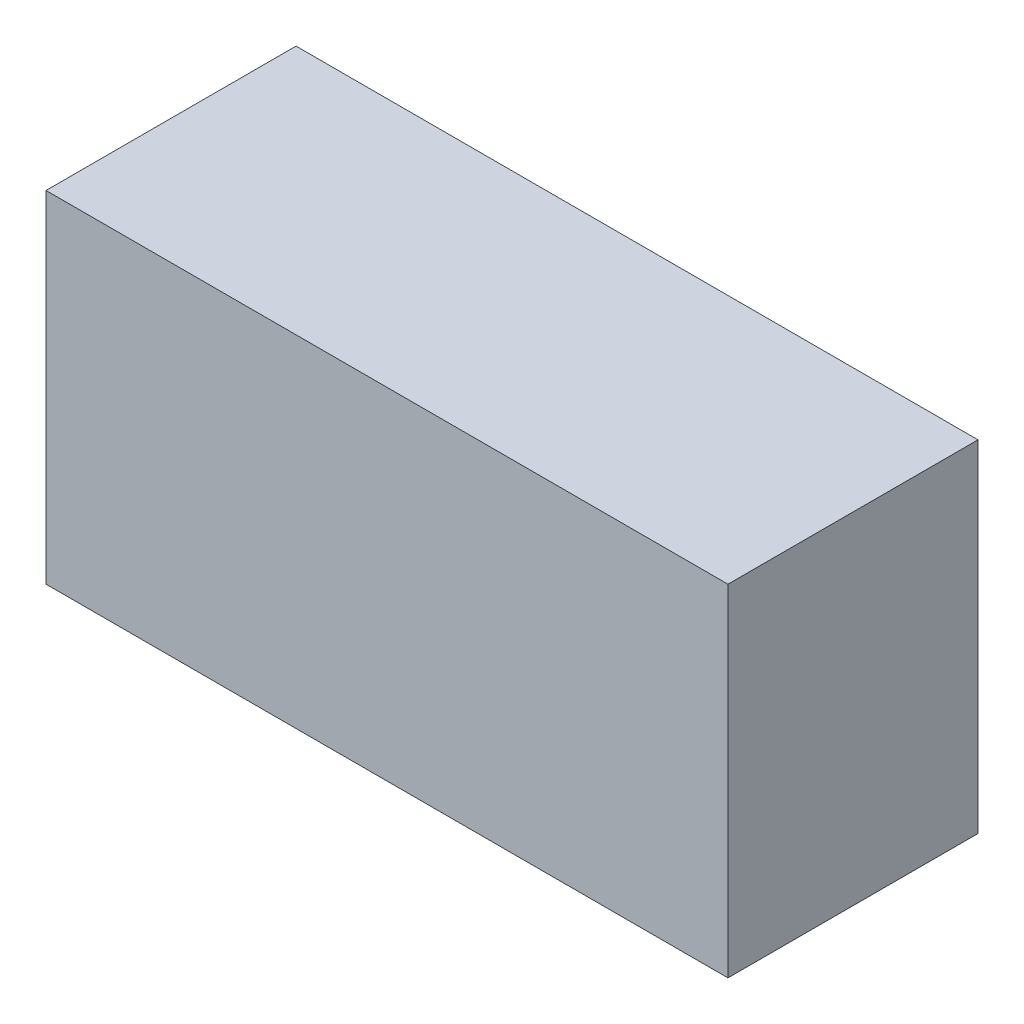
ISO-10303-21;
HEADER;
FILE_DESCRIPTION(('STEP AP214'),'2;1');
FILE_NAME('part.step','',(''),(''),'','','');
FILE_SCHEMA(('AUTOMOTIVE_DESIGN { 1 0 10303 214 1 1 1 1 }'));
ENDSEC;
DATA;
#1=APPLICATION_CONTEXT('core data for automotive mechanical design processes');
#2=APPLICATION_PROTOCOL_DEFINITION('international standard','automotive_design',2000,#1);
#3=PRODUCT_CONTEXT('',#1,'mechanical');
#4=PRODUCT('Part','Part','',(#3));
#5=PRODUCT_RELATED_PRODUCT_CATEGORY('part','',(#4));
#6=PRODUCT_DEFINITION_FORMATION('','',#4);
#7=PRODUCT_DEFINITION_CONTEXT('part definition',#1,'design');
#8=PRODUCT_DEFINITION('design','',#6,#7);
#9=PRODUCT_DEFINITION_SHAPE('','',#8);
#10=(LENGTH_UNIT() NAMED_UNIT(*) SI_UNIT(.MILLI.,.METRE.));
#11=(NAMED_UNIT(*) PLANE_ANGLE_UNIT() SI_UNIT($,.RADIAN.));
#12=(NAMED_UNIT(*) SI_UNIT($,.STERADIAN.) SOLID_ANGLE_UNIT());
#13=UNCERTAINTY_MEASURE_WITH_UNIT(LENGTH_MEASURE(1.E-05),#10,'distance_accuracy_value','');
#14=(GEOMETRIC_REPRESENTATION_CONTEXT(3) GLOBAL_UNCERTAINTY_ASSIGNED_CONTEXT((#13)) GLOBAL_UNIT_ASSIGNED_CONTEXT((#10,
#11,#12)) REPRESENTATION_CONTEXT('',''));
#15=CARTESIAN_POINT('',(0.,0.,0.));
#16=DIRECTION('',(0.,0.,1.));
#17=DIRECTION('',(1.,0.,0.));
#18=AXIS2_PLACEMENT_3D('',#15,#16,#17);
#19=CARTESIAN_POINT('',(0.4,-14.7,-2.15));
#20=DIRECTION('',(0.,0.,1.));
#21=DIRECTION('',(1.,0.,0.));
#22=AXIS2_PLACEMENT_3D('',#19,#20,#21);
#23=PLANE('',#22);
#24=DIRECTION('',(0.,1.,0.));
#25=VECTOR('',#24,1.);
#26=CARTESIAN_POINT('',(0.2,-14.7,-2.15));
#27=LINE('',#26,#25);
#28=CARTESIAN_POINT('',(0.200000000000002,-18.7,-2.15));
#29=VERTEX_POINT('',#28);
#30=CARTESIAN_POINT('',(0.2,-14.7,-2.15));
#31=VERTEX_POINT('',#30);
#32=EDGE_CURVE('E236',#29,#31,#27,.T.);
#33=ORIENTED_EDGE('',*,*,#32,.T.);
#34=DIRECTION('',(1.,0.,0.));
#35=VECTOR('',#34,1.);
#36=CARTESIAN_POINT('',(0.4,-14.7,-2.15));
#37=LINE('',#36,#35);
#38=CARTESIAN_POINT('',(0.400000000000001,-14.7,-2.15));
#39=VERTEX_POINT('',#38);
#40=EDGE_CURVE('E19',#39,#31,#37,.F.);
#41=ORIENTED_EDGE('',*,*,#40,.F.);
#42=DIRECTION('',(0.,1.,0.));
#43=VECTOR('',#42,1.);
#44=CARTESIAN_POINT('',(0.399999999999999,-14.7,-2.15));
#45=LINE('',#44,#43);
#46=CARTESIAN_POINT('',(0.400000000000004,-18.7,-2.15));
#47=VERTEX_POINT('',#46);
#48=EDGE_CURVE('E270',#39,#47,#45,.F.);
#49=ORIENTED_EDGE('',*,*,#48,.T.);
#50=DIRECTION('',(1.,0.,0.));
#51=VECTOR('',#50,1.);
#52=CARTESIAN_POINT('',(0.4,-18.7,-2.15));
#53=LINE('',#52,#51);
#54=EDGE_CURVE('E231',#29,#47,#53,.T.);
#55=ORIENTED_EDGE('',*,*,#54,.F.);
#56=EDGE_LOOP('',(#33,#41,#49,#55));
#57=FACE_BOUND('',#56,.T.);
#58=ADVANCED_FACE('F16',(#57),#23,.F.);
#59=CARTESIAN_POINT('',(1.6,-14.7,-2.15));
#60=DIRECTION('',(0.,0.,1.));
#61=DIRECTION('',(1.,0.,0.));
#62=AXIS2_PLACEMENT_3D('',#59,#60,#61);
#63=PLANE('',#62);
#64=DIRECTION('',(0.,1.,0.));
#65=VECTOR('',#64,1.);
#66=CARTESIAN_POINT('',(1.4,-14.7,-2.15));
#67=LINE('',#66,#65);
#68=CARTESIAN_POINT('',(1.4,-18.7,-2.15));
#69=VERTEX_POINT('',#68);
#70=CARTESIAN_POINT('',(1.4,-14.7,-2.15));
#71=VERTEX_POINT('',#70);
#72=EDGE_CURVE('E277',#69,#71,#67,.T.);
#73=ORIENTED_EDGE('',*,*,#72,.T.);
#74=DIRECTION('',(1.,0.,0.));
#75=VECTOR('',#74,1.);
#76=CARTESIAN_POINT('',(1.6,-14.7,-2.15));
#77=LINE('',#76,#75);
#78=CARTESIAN_POINT('',(1.6,-14.7,-2.15));
#79=VERTEX_POINT('',#78);
#80=EDGE_CURVE('E262',#79,#71,#77,.F.);
#81=ORIENTED_EDGE('',*,*,#80,.F.);
#82=DIRECTION('',(0.,1.,0.));
#83=VECTOR('',#82,1.);
#84=CARTESIAN_POINT('',(1.6,-14.7,-2.15));
#85=LINE('',#84,#83);
#86=CARTESIAN_POINT('',(1.6,-18.7,-2.15));
#87=VERTEX_POINT('',#86);
#88=EDGE_CURVE('E288',#79,#87,#85,.F.);
#89=ORIENTED_EDGE('',*,*,#88,.T.);
#90=DIRECTION('',(1.,0.,0.));
#91=VECTOR('',#90,1.);
#92=CARTESIAN_POINT('',(1.6,-18.7,-2.15));
#93=LINE('',#92,#91);
#94=EDGE_CURVE('E260',#69,#87,#93,.T.);
#95=ORIENTED_EDGE('',*,*,#94,.F.);
#96=EDGE_LOOP('',(#73,#81,#89,#95));
#97=FACE_BOUND('',#96,.T.);
#98=ADVANCED_FACE('F636',(#97),#63,.F.);
#99=CARTESIAN_POINT('',(2.8,-14.7,-2.15));
#100=DIRECTION('',(0.,0.,1.));
#101=DIRECTION('',(1.,0.,0.));
#102=AXIS2_PLACEMENT_3D('',#99,#100,#101);
#103=PLANE('',#102);
#104=DIRECTION('',(0.,1.,0.));
#105=VECTOR('',#104,1.);
#106=CARTESIAN_POINT('',(2.6,-14.7,-2.15));
#107=LINE('',#106,#105);
#108=CARTESIAN_POINT('',(2.6,-18.7,-2.15));
#109=VERTEX_POINT('',#108);
#110=CARTESIAN_POINT('',(2.6,-14.7,-2.15));
#111=VERTEX_POINT('',#110);
#112=EDGE_CURVE('E296',#109,#111,#107,.T.);
#113=ORIENTED_EDGE('',*,*,#112,.T.);
#114=DIRECTION('',(1.,0.,0.));
#115=VECTOR('',#114,1.);
#116=CARTESIAN_POINT('',(2.8,-14.7,-2.15));
#117=LINE('',#116,#115);
#118=CARTESIAN_POINT('',(2.8,-14.7,-2.15));
#119=VERTEX_POINT('',#118);
#120=EDGE_CURVE('E258',#119,#111,#117,.F.);
#121=ORIENTED_EDGE('',*,*,#120,.F.);
#122=DIRECTION('',(0.,-1.,0.));
#123=VECTOR('',#122,1.);
#124=CARTESIAN_POINT('',(2.8,-14.7,-2.15));
#125=LINE('',#124,#123);
#126=CARTESIAN_POINT('',(2.8,-18.7,-2.15));
#127=VERTEX_POINT('',#126);
#128=EDGE_CURVE('E304',#119,#127,#125,.T.);
#129=ORIENTED_EDGE('',*,*,#128,.T.);
#130=DIRECTION('',(1.,0.,0.));
#131=VECTOR('',#130,1.);
#132=CARTESIAN_POINT('',(2.8,-18.7,-2.15));
#133=LINE('',#132,#131);
#134=EDGE_CURVE('E256',#109,#127,#133,.T.);
#135=ORIENTED_EDGE('',*,*,#134,.F.);
#136=EDGE_LOOP('',(#113,#121,#129,#135));
#137=FACE_BOUND('',#136,.T.);
#138=ADVANCED_FACE('F633',(#137),#103,.F.);
#139=CARTESIAN_POINT('',(4.,-14.7,-2.15));
#140=DIRECTION('',(0.,0.,1.));
#141=DIRECTION('',(1.,0.,0.));
#142=AXIS2_PLACEMENT_3D('',#139,#140,#141);
#143=PLANE('',#142);
#144=DIRECTION('',(0.,1.,0.));
#145=VECTOR('',#144,1.);
#146=CARTESIAN_POINT('',(3.8,-14.7,-2.15));
#147=LINE('',#146,#145);
#148=CARTESIAN_POINT('',(3.8,-18.7,-2.15));
#149=VERTEX_POINT('',#148);
#150=CARTESIAN_POINT('',(3.8,-14.7,-2.15));
#151=VERTEX_POINT('',#150);
#152=EDGE_CURVE('E312',#149,#151,#147,.T.);
#153=ORIENTED_EDGE('',*,*,#152,.T.);
#154=DIRECTION('',(1.,0.,0.));
#155=VECTOR('',#154,1.);
#156=CARTESIAN_POINT('',(4.,-14.7,-2.15));
#157=LINE('',#156,#155);
#158=CARTESIAN_POINT('',(4.,-14.7,-2.15));
#159=VERTEX_POINT('',#158);
#160=EDGE_CURVE('E254',#159,#151,#157,.F.);
#161=ORIENTED_EDGE('',*,*,#160,.F.);
#162=DIRECTION('',(0.,-1.,0.));
#163=VECTOR('',#162,1.);
#164=CARTESIAN_POINT('',(4.,-14.7,-2.15));
#165=LINE('',#164,#163);
#166=CARTESIAN_POINT('',(4.,-18.7,-2.15));
#167=VERTEX_POINT('',#166);
#168=EDGE_CURVE('E320',#159,#167,#165,.T.);
#169=ORIENTED_EDGE('',*,*,#168,.T.);
#170=DIRECTION('',(1.,0.,0.));
#171=VECTOR('',#170,1.);
#172=CARTESIAN_POINT('',(4.,-18.7,-2.15));
#173=LINE('',#172,#171);
#174=EDGE_CURVE('E252',#149,#167,#173,.T.);
#175=ORIENTED_EDGE('',*,*,#174,.F.);
#176=EDGE_LOOP('',(#153,#161,#169,#175));
#177=FACE_BOUND('',#176,.T.);
#178=ADVANCED_FACE('F629',(#177),#143,.F.);
#179=CARTESIAN_POINT('',(5.2,-14.7,-2.15));
#180=DIRECTION('',(0.,0.,1.));
#181=DIRECTION('',(1.,0.,0.));
#182=AXIS2_PLACEMENT_3D('',#179,#180,#181);
#183=PLANE('',#182);
#184=DIRECTION('',(0.,1.,0.));
#185=VECTOR('',#184,1.);
#186=CARTESIAN_POINT('',(5.,-14.7,-2.15));
#187=LINE('',#186,#185);
#188=CARTESIAN_POINT('',(5.,-18.7,-2.15));
#189=VERTEX_POINT('',#188);
#190=CARTESIAN_POINT('',(5.,-14.7,-2.15));
#191=VERTEX_POINT('',#190);
#192=EDGE_CURVE('E328',#189,#191,#187,.T.);
#193=ORIENTED_EDGE('',*,*,#192,.T.);
#194=DIRECTION('',(1.,0.,0.));
#195=VECTOR('',#194,1.);
#196=CARTESIAN_POINT('',(5.2,-14.7,-2.15));
#197=LINE('',#196,#195);
#198=CARTESIAN_POINT('',(5.2,-14.7,-2.15));
#199=VERTEX_POINT('',#198);
#200=EDGE_CURVE('E250',#199,#191,#197,.F.);
#201=ORIENTED_EDGE('',*,*,#200,.F.);
#202=DIRECTION('',(0.,-1.,0.));
#203=VECTOR('',#202,1.);
#204=CARTESIAN_POINT('',(5.2,-14.7,-2.15));
#205=LINE('',#204,#203);
#206=CARTESIAN_POINT('',(5.2,-18.7,-2.15));
#207=VERTEX_POINT('',#206);
#208=EDGE_CURVE('E336',#199,#207,#205,.T.);
#209=ORIENTED_EDGE('',*,*,#208,.T.);
#210=DIRECTION('',(1.,0.,0.));
#211=VECTOR('',#210,1.);
#212=CARTESIAN_POINT('',(5.2,-18.7,-2.15));
#213=LINE('',#212,#211);
#214=EDGE_CURVE('E248',#189,#207,#213,.T.);
#215=ORIENTED_EDGE('',*,*,#214,.F.);
#216=EDGE_LOOP('',(#193,#201,#209,#215));
#217=FACE_BOUND('',#216,.T.);
#218=ADVANCED_FACE('F625',(#217),#183,.F.);
#219=CARTESIAN_POINT('',(6.4,-14.7,-2.15));
#220=DIRECTION('',(0.,0.,1.));
#221=DIRECTION('',(1.,0.,0.));
#222=AXIS2_PLACEMENT_3D('',#219,#220,#221);
#223=PLANE('',#222);
#224=DIRECTION('',(0.,1.,0.));
#225=VECTOR('',#224,1.);
#226=CARTESIAN_POINT('',(6.2,-14.7,-2.15));
#227=LINE('',#226,#225);
#228=CARTESIAN_POINT('',(6.2,-18.7,-2.15));
#229=VERTEX_POINT('',#228);
#230=CARTESIAN_POINT('',(6.2,-14.7,-2.15));
#231=VERTEX_POINT('',#230);
#232=EDGE_CURVE('E344',#229,#231,#227,.T.);
#233=ORIENTED_EDGE('',*,*,#232,.T.);
#234=DIRECTION('',(1.,0.,0.));
#235=VECTOR('',#234,1.);
#236=CARTESIAN_POINT('',(6.4,-14.7,-2.15));
#237=LINE('',#236,#235);
#238=CARTESIAN_POINT('',(6.4,-14.7,-2.15));
#239=VERTEX_POINT('',#238);
#240=EDGE_CURVE('E243',#239,#231,#237,.F.);
#241=ORIENTED_EDGE('',*,*,#240,.F.);
#242=DIRECTION('',(0.,-1.,0.));
#243=VECTOR('',#242,1.);
#244=CARTESIAN_POINT('',(6.4,-14.7,-2.15));
#245=LINE('',#244,#243);
#246=CARTESIAN_POINT('',(6.4,-18.7,-2.15));
#247=VERTEX_POINT('',#246);
#248=EDGE_CURVE('E352',#239,#247,#245,.T.);
#249=ORIENTED_EDGE('',*,*,#248,.T.);
#250=DIRECTION('',(1.,0.,0.));
#251=VECTOR('',#250,1.);
#252=CARTESIAN_POINT('',(6.4,-18.7,-2.15));
#253=LINE('',#252,#251);
#254=EDGE_CURVE('E241',#229,#247,#253,.T.);
#255=ORIENTED_EDGE('',*,*,#254,.F.);
#256=EDGE_LOOP('',(#233,#241,#249,#255));
#257=FACE_BOUND('',#256,.T.);
#258=ADVANCED_FACE('F622',(#257),#223,.F.);
#259=CARTESIAN_POINT('',(0.2,-14.7,-2.15));
#260=DIRECTION('',(1.,0.,0.));
#261=DIRECTION('',(0.,1.,0.));
#262=AXIS2_PLACEMENT_3D('',#259,#260,#261);
#263=PLANE('',#262);
#264=DIRECTION('',(0.,1.,0.));
#265=VECTOR('',#264,1.);
#266=CARTESIAN_POINT('',(0.200000000000004,-14.7,-1.15));
#267=LINE('',#266,#265);
#268=CARTESIAN_POINT('',(0.200000000000004,-18.7,-1.15));
#269=VERTEX_POINT('',#268);
#270=CARTESIAN_POINT('',(0.200000000000001,-14.7,-1.15));
#271=VERTEX_POINT('',#270);
#272=EDGE_CURVE('E238',#269,#271,#267,.T.);
#273=ORIENTED_EDGE('',*,*,#272,.T.);
#274=DIRECTION('',(0.,0.,1.));
#275=VECTOR('',#274,1.);
#276=CARTESIAN_POINT('',(0.2,-14.7,-2.15));
#277=LINE('',#276,#275);
#278=EDGE_CURVE('E228',#31,#271,#277,.T.);
#279=ORIENTED_EDGE('',*,*,#278,.F.);
#280=ORIENTED_EDGE('',*,*,#32,.F.);
#281=DIRECTION('',(0.,0.,1.));
#282=VECTOR('',#281,1.);
#283=CARTESIAN_POINT('',(0.200000000000004,-18.7,-3.3));
#284=LINE('',#283,#282);
#285=EDGE_CURVE('E269',#269,#29,#284,.F.);
#286=ORIENTED_EDGE('',*,*,#285,.F.);
#287=EDGE_LOOP('',(#273,#279,#280,#286));
#288=FACE_BOUND('',#287,.T.);
#289=ADVANCED_FACE('F234',(#288),#263,.F.);
#290=CARTESIAN_POINT('',(0.4,-14.7,-1.15));
#291=DIRECTION('',(-1.,0.,0.));
#292=DIRECTION('',(0.,0.,1.));
#293=AXIS2_PLACEMENT_3D('',#290,#291,#292);
#294=PLANE('',#293);
#295=ORIENTED_EDGE('',*,*,#48,.F.);
#296=DIRECTION('',(0.,0.,1.));
#297=VECTOR('',#296,1.);
#298=CARTESIAN_POINT('',(0.4,-14.7,-1.15));
#299=LINE('',#298,#297);
#300=CARTESIAN_POINT('',(0.4,-14.7,-1.15));
#301=VERTEX_POINT('',#300);
#302=EDGE_CURVE('E230',#301,#39,#299,.F.);
#303=ORIENTED_EDGE('',*,*,#302,.F.);
#304=DIRECTION('',(0.,1.,0.));
#305=VECTOR('',#304,1.);
#306=CARTESIAN_POINT('',(0.4,-14.7,-1.15));
#307=LINE('',#306,#305);
#308=CARTESIAN_POINT('',(0.400000000000003,-18.7,-1.15));
#309=VERTEX_POINT('',#308);
#310=EDGE_CURVE('E276',#301,#309,#307,.F.);
#311=ORIENTED_EDGE('',*,*,#310,.T.);
#312=DIRECTION('',(0.,0.,1.));
#313=VECTOR('',#312,1.);
#314=CARTESIAN_POINT('',(0.400000000000005,-18.7,-3.3));
#315=LINE('',#314,#313);
#316=EDGE_CURVE('E267',#47,#309,#315,.T.);
#317=ORIENTED_EDGE('',*,*,#316,.F.);
#318=EDGE_LOOP('',(#295,#303,#311,#317));
#319=FACE_BOUND('',#318,.T.);
#320=ADVANCED_FACE('F274',(#319),#294,.F.);
#321=CARTESIAN_POINT('',(-1.2,-18.7,-3.3));
#322=DIRECTION('',(0.,-1.,0.));
#323=DIRECTION('',(1.,0.,0.));
#324=AXIS2_PLACEMENT_3D('',#321,#322,#323);
#325=PLANE('',#324);
#326=ORIENTED_EDGE('',*,*,#54,.T.);
#327=ORIENTED_EDGE('',*,*,#316,.T.);
#328=DIRECTION('',(-1.,0.,0.));
#329=VECTOR('',#328,1.);
#330=CARTESIAN_POINT('',(0.2,-18.7,-1.15));
#331=LINE('',#330,#329);
#332=EDGE_CURVE('E362',#309,#269,#331,.T.);
#333=ORIENTED_EDGE('',*,*,#332,.T.);
#334=ORIENTED_EDGE('',*,*,#285,.T.);
#335=EDGE_LOOP('',(#326,#327,#333,#334));
#336=FACE_BOUND('',#335,.T.);
#337=ADVANCED_FACE('F264',(#336),#325,.T.);
#338=CARTESIAN_POINT('',(1.4,-14.7,-2.15));
#339=DIRECTION('',(1.,0.,0.));
#340=DIRECTION('',(0.,1.,0.));
#341=AXIS2_PLACEMENT_3D('',#338,#339,#340);
#342=PLANE('',#341);
#343=DIRECTION('',(0.,1.,0.));
#344=VECTOR('',#343,1.);
#345=CARTESIAN_POINT('',(1.4,-14.7,-1.15));
#346=LINE('',#345,#344);
#347=CARTESIAN_POINT('',(1.4,-18.7,-1.15));
#348=VERTEX_POINT('',#347);
#349=CARTESIAN_POINT('',(1.4,-14.7,-1.15));
#350=VERTEX_POINT('',#349);
#351=EDGE_CURVE('E364',#348,#350,#346,.T.);
#352=ORIENTED_EDGE('',*,*,#351,.T.);
#353=DIRECTION('',(0.,0.,1.));
#354=VECTOR('',#353,1.);
#355=CARTESIAN_POINT('',(1.4,-14.7,-2.15));
#356=LINE('',#355,#354);
#357=EDGE_CURVE('E280',#71,#350,#356,.T.);
#358=ORIENTED_EDGE('',*,*,#357,.F.);
#359=ORIENTED_EDGE('',*,*,#72,.F.);
#360=DIRECTION('',(0.,0.,1.));
#361=VECTOR('',#360,1.);
#362=CARTESIAN_POINT('',(1.4,-18.7,-3.3));
#363=LINE('',#362,#361);
#364=EDGE_CURVE('E291',#348,#69,#363,.F.);
#365=ORIENTED_EDGE('',*,*,#364,.F.);
#366=EDGE_LOOP('',(#352,#358,#359,#365));
#367=FACE_BOUND('',#366,.T.);
#368=ADVANCED_FACE('F611',(#367),#342,.F.);
#369=CARTESIAN_POINT('',(1.6,-14.7,-1.15));
#370=DIRECTION('',(-1.,0.,0.));
#371=DIRECTION('',(0.,0.,1.));
#372=AXIS2_PLACEMENT_3D('',#369,#370,#371);
#373=PLANE('',#372);
#374=ORIENTED_EDGE('',*,*,#88,.F.);
#375=DIRECTION('',(0.,0.,1.));
#376=VECTOR('',#375,1.);
#377=CARTESIAN_POINT('',(1.6,-14.7,-1.15));
#378=LINE('',#377,#376);
#379=CARTESIAN_POINT('',(1.6,-14.7,-1.15));
#380=VERTEX_POINT('',#379);
#381=EDGE_CURVE('E285',#380,#79,#378,.F.);
#382=ORIENTED_EDGE('',*,*,#381,.F.);
#383=DIRECTION('',(0.,1.,0.));
#384=VECTOR('',#383,1.);
#385=CARTESIAN_POINT('',(1.6,-14.7,-1.15));
#386=LINE('',#385,#384);
#387=CARTESIAN_POINT('',(1.6,-18.7,-1.15));
#388=VERTEX_POINT('',#387);
#389=EDGE_CURVE('E367',#380,#388,#386,.F.);
#390=ORIENTED_EDGE('',*,*,#389,.T.);
#391=DIRECTION('',(0.,0.,1.));
#392=VECTOR('',#391,1.);
#393=CARTESIAN_POINT('',(1.6,-18.7,-3.3));
#394=LINE('',#393,#392);
#395=EDGE_CURVE('E294',#87,#388,#394,.T.);
#396=ORIENTED_EDGE('',*,*,#395,.F.);
#397=EDGE_LOOP('',(#374,#382,#390,#396));
#398=FACE_BOUND('',#397,.T.);
#399=ADVANCED_FACE('F607',(#398),#373,.F.);
#400=CARTESIAN_POINT('',(-1.2,-18.7,-3.3));
#401=DIRECTION('',(0.,-1.,0.));
#402=DIRECTION('',(1.,0.,0.));
#403=AXIS2_PLACEMENT_3D('',#400,#401,#402);
#404=PLANE('',#403);
#405=ORIENTED_EDGE('',*,*,#94,.T.);
#406=ORIENTED_EDGE('',*,*,#395,.T.);
#407=DIRECTION('',(-1.,0.,0.));
#408=VECTOR('',#407,1.);
#409=CARTESIAN_POINT('',(1.4,-18.7,-1.15));
#410=LINE('',#409,#408);
#411=EDGE_CURVE('E370',#388,#348,#410,.T.);
#412=ORIENTED_EDGE('',*,*,#411,.T.);
#413=ORIENTED_EDGE('',*,*,#364,.T.);
#414=EDGE_LOOP('',(#405,#406,#412,#413));
#415=FACE_BOUND('',#414,.T.);
#416=ADVANCED_FACE('F603',(#415),#404,.T.);
#417=CARTESIAN_POINT('',(2.6,-14.7,-2.15));
#418=DIRECTION('',(1.,0.,0.));
#419=DIRECTION('',(0.,1.,0.));
#420=AXIS2_PLACEMENT_3D('',#417,#418,#419);
#421=PLANE('',#420);
#422=DIRECTION('',(0.,1.,0.));
#423=VECTOR('',#422,1.);
#424=CARTESIAN_POINT('',(2.6,-14.7,-1.15));
#425=LINE('',#424,#423);
#426=CARTESIAN_POINT('',(2.6,-18.7,-1.15));
#427=VERTEX_POINT('',#426);
#428=CARTESIAN_POINT('',(2.6,-14.7,-1.15));
#429=VERTEX_POINT('',#428);
#430=EDGE_CURVE('E373',#427,#429,#425,.T.);
#431=ORIENTED_EDGE('',*,*,#430,.T.);
#432=DIRECTION('',(0.,0.,1.));
#433=VECTOR('',#432,1.);
#434=CARTESIAN_POINT('',(2.6,-14.7,-2.15));
#435=LINE('',#434,#433);
#436=EDGE_CURVE('E299',#111,#429,#435,.T.);
#437=ORIENTED_EDGE('',*,*,#436,.F.);
#438=ORIENTED_EDGE('',*,*,#112,.F.);
#439=DIRECTION('',(0.,0.,1.));
#440=VECTOR('',#439,1.);
#441=CARTESIAN_POINT('',(2.6,-18.7,-3.3));
#442=LINE('',#441,#440);
#443=EDGE_CURVE('E307',#427,#109,#442,.F.);
#444=ORIENTED_EDGE('',*,*,#443,.F.);
#445=EDGE_LOOP('',(#431,#437,#438,#444));
#446=FACE_BOUND('',#445,.T.);
#447=ADVANCED_FACE('F599',(#446),#421,.F.);
#448=CARTESIAN_POINT('',(2.8,-14.7,-1.15));
#449=DIRECTION('',(-1.,0.,0.));
#450=DIRECTION('',(0.,-1.,0.));
#451=AXIS2_PLACEMENT_3D('',#448,#449,#450);
#452=PLANE('',#451);
#453=ORIENTED_EDGE('',*,*,#128,.F.);
#454=DIRECTION('',(0.,0.,1.));
#455=VECTOR('',#454,1.);
#456=CARTESIAN_POINT('',(2.8,-14.7,-1.15));
#457=LINE('',#456,#455);
#458=CARTESIAN_POINT('',(2.8,-14.7,-1.15));
#459=VERTEX_POINT('',#458);
#460=EDGE_CURVE('E301',#459,#119,#457,.F.);
#461=ORIENTED_EDGE('',*,*,#460,.F.);
#462=DIRECTION('',(0.,1.,0.));
#463=VECTOR('',#462,1.);
#464=CARTESIAN_POINT('',(2.8,-14.7,-1.15));
#465=LINE('',#464,#463);
#466=CARTESIAN_POINT('',(2.8,-18.7,-1.15));
#467=VERTEX_POINT('',#466);
#468=EDGE_CURVE('E376',#459,#467,#465,.F.);
#469=ORIENTED_EDGE('',*,*,#468,.T.);
#470=DIRECTION('',(0.,0.,1.));
#471=VECTOR('',#470,1.);
#472=CARTESIAN_POINT('',(2.8,-18.7,-3.3));
#473=LINE('',#472,#471);
#474=EDGE_CURVE('E310',#127,#467,#473,.T.);
#475=ORIENTED_EDGE('',*,*,#474,.F.);
#476=EDGE_LOOP('',(#453,#461,#469,#475));
#477=FACE_BOUND('',#476,.T.);
#478=ADVANCED_FACE('F595',(#477),#452,.F.);
#479=CARTESIAN_POINT('',(-1.2,-18.7,-3.3));
#480=DIRECTION('',(0.,-1.,0.));
#481=DIRECTION('',(1.,0.,0.));
#482=AXIS2_PLACEMENT_3D('',#479,#480,#481);
#483=PLANE('',#482);
#484=ORIENTED_EDGE('',*,*,#134,.T.);
#485=ORIENTED_EDGE('',*,*,#474,.T.);
#486=DIRECTION('',(-1.,0.,0.));
#487=VECTOR('',#486,1.);
#488=CARTESIAN_POINT('',(2.6,-18.7,-1.15));
#489=LINE('',#488,#487);
#490=EDGE_CURVE('E379',#467,#427,#489,.T.);
#491=ORIENTED_EDGE('',*,*,#490,.T.);
#492=ORIENTED_EDGE('',*,*,#443,.T.);
#493=EDGE_LOOP('',(#484,#485,#491,#492));
#494=FACE_BOUND('',#493,.T.);
#495=ADVANCED_FACE('F591',(#494),#483,.T.);
#496=CARTESIAN_POINT('',(3.8,-14.7,-2.15));
#497=DIRECTION('',(1.,0.,0.));
#498=DIRECTION('',(0.,1.,0.));
#499=AXIS2_PLACEMENT_3D('',#496,#497,#498);
#500=PLANE('',#499);
#501=DIRECTION('',(0.,1.,0.));
#502=VECTOR('',#501,1.);
#503=CARTESIAN_POINT('',(3.8,-14.7,-1.15));
#504=LINE('',#503,#502);
#505=CARTESIAN_POINT('',(3.8,-18.7,-1.15));
#506=VERTEX_POINT('',#505);
#507=CARTESIAN_POINT('',(3.8,-14.7,-1.15));
#508=VERTEX_POINT('',#507);
#509=EDGE_CURVE('E382',#506,#508,#504,.T.);
#510=ORIENTED_EDGE('',*,*,#509,.T.);
#511=DIRECTION('',(0.,0.,1.));
#512=VECTOR('',#511,1.);
#513=CARTESIAN_POINT('',(3.8,-14.7,-2.15));
#514=LINE('',#513,#512);
#515=EDGE_CURVE('E315',#151,#508,#514,.T.);
#516=ORIENTED_EDGE('',*,*,#515,.F.);
#517=ORIENTED_EDGE('',*,*,#152,.F.);
#518=DIRECTION('',(0.,0.,1.));
#519=VECTOR('',#518,1.);
#520=CARTESIAN_POINT('',(3.8,-18.7,-3.3));
#521=LINE('',#520,#519);
#522=EDGE_CURVE('E323',#506,#149,#521,.F.);
#523=ORIENTED_EDGE('',*,*,#522,.F.);
#524=EDGE_LOOP('',(#510,#516,#517,#523));
#525=FACE_BOUND('',#524,.T.);
#526=ADVANCED_FACE('F587',(#525),#500,.F.);
#527=CARTESIAN_POINT('',(4.,-14.7,-1.15));
#528=DIRECTION('',(-1.,0.,0.));
#529=DIRECTION('',(0.,-1.,0.));
#530=AXIS2_PLACEMENT_3D('',#527,#528,#529);
#531=PLANE('',#530);
#532=ORIENTED_EDGE('',*,*,#168,.F.);
#533=DIRECTION('',(0.,0.,1.));
#534=VECTOR('',#533,1.);
#535=CARTESIAN_POINT('',(4.,-14.7,-1.15));
#536=LINE('',#535,#534);
#537=CARTESIAN_POINT('',(4.,-14.7,-1.15));
#538=VERTEX_POINT('',#537);
#539=EDGE_CURVE('E317',#538,#159,#536,.F.);
#540=ORIENTED_EDGE('',*,*,#539,.F.);
#541=DIRECTION('',(0.,1.,0.));
#542=VECTOR('',#541,1.);
#543=CARTESIAN_POINT('',(4.,-14.7,-1.15));
#544=LINE('',#543,#542);
#545=CARTESIAN_POINT('',(4.,-18.7,-1.15));
#546=VERTEX_POINT('',#545);
#547=EDGE_CURVE('E385',#538,#546,#544,.F.);
#548=ORIENTED_EDGE('',*,*,#547,.T.);
#549=DIRECTION('',(0.,0.,1.));
#550=VECTOR('',#549,1.);
#551=CARTESIAN_POINT('',(4.,-18.7,-3.3));
#552=LINE('',#551,#550);
#553=EDGE_CURVE('E326',#167,#546,#552,.T.);
#554=ORIENTED_EDGE('',*,*,#553,.F.);
#555=EDGE_LOOP('',(#532,#540,#548,#554));
#556=FACE_BOUND('',#555,.T.);
#557=ADVANCED_FACE('F583',(#556),#531,.F.);
#558=CARTESIAN_POINT('',(-1.2,-18.7,-3.3));
#559=DIRECTION('',(0.,-1.,0.));
#560=DIRECTION('',(1.,0.,0.));
#561=AXIS2_PLACEMENT_3D('',#558,#559,#560);
#562=PLANE('',#561);
#563=ORIENTED_EDGE('',*,*,#174,.T.);
#564=ORIENTED_EDGE('',*,*,#553,.T.);
#565=DIRECTION('',(-1.,0.,0.));
#566=VECTOR('',#565,1.);
#567=CARTESIAN_POINT('',(3.8,-18.7,-1.15));
#568=LINE('',#567,#566);
#569=EDGE_CURVE('E388',#546,#506,#568,.T.);
#570=ORIENTED_EDGE('',*,*,#569,.T.);
#571=ORIENTED_EDGE('',*,*,#522,.T.);
#572=EDGE_LOOP('',(#563,#564,#570,#571));
#573=FACE_BOUND('',#572,.T.);
#574=ADVANCED_FACE('F579',(#573),#562,.T.);
#575=CARTESIAN_POINT('',(5.,-14.7,-2.15));
#576=DIRECTION('',(1.,0.,0.));
#577=DIRECTION('',(0.,1.,0.));
#578=AXIS2_PLACEMENT_3D('',#575,#576,#577);
#579=PLANE('',#578);
#580=DIRECTION('',(0.,1.,0.));
#581=VECTOR('',#580,1.);
#582=CARTESIAN_POINT('',(5.,-14.7,-1.15));
#583=LINE('',#582,#581);
#584=CARTESIAN_POINT('',(5.,-18.7,-1.15));
#585=VERTEX_POINT('',#584);
#586=CARTESIAN_POINT('',(5.,-14.7,-1.15));
#587=VERTEX_POINT('',#586);
#588=EDGE_CURVE('E391',#585,#587,#583,.T.);
#589=ORIENTED_EDGE('',*,*,#588,.T.);
#590=DIRECTION('',(0.,0.,1.));
#591=VECTOR('',#590,1.);
#592=CARTESIAN_POINT('',(5.,-14.7,-2.15));
#593=LINE('',#592,#591);
#594=EDGE_CURVE('E331',#191,#587,#593,.T.);
#595=ORIENTED_EDGE('',*,*,#594,.F.);
#596=ORIENTED_EDGE('',*,*,#192,.F.);
#597=DIRECTION('',(0.,0.,1.));
#598=VECTOR('',#597,1.);
#599=CARTESIAN_POINT('',(5.,-18.7,-3.3));
#600=LINE('',#599,#598);
#601=EDGE_CURVE('E339',#585,#189,#600,.F.);
#602=ORIENTED_EDGE('',*,*,#601,.F.);
#603=EDGE_LOOP('',(#589,#595,#596,#602));
#604=FACE_BOUND('',#603,.T.);
#605=ADVANCED_FACE('F575',(#604),#579,.F.);
#606=CARTESIAN_POINT('',(5.2,-14.7,-1.15));
#607=DIRECTION('',(-1.,0.,0.));
#608=DIRECTION('',(0.,-1.,0.));
#609=AXIS2_PLACEMENT_3D('',#606,#607,#608);
#610=PLANE('',#609);
#611=ORIENTED_EDGE('',*,*,#208,.F.);
#612=DIRECTION('',(0.,0.,1.));
#613=VECTOR('',#612,1.);
#614=CARTESIAN_POINT('',(5.2,-14.7,-1.15));
#615=LINE('',#614,#613);
#616=CARTESIAN_POINT('',(5.2,-14.7,-1.15));
#617=VERTEX_POINT('',#616);
#618=EDGE_CURVE('E333',#617,#199,#615,.F.);
#619=ORIENTED_EDGE('',*,*,#618,.F.);
#620=DIRECTION('',(0.,1.,0.));
#621=VECTOR('',#620,1.);
#622=CARTESIAN_POINT('',(5.2,-14.7,-1.15));
#623=LINE('',#622,#621);
#624=CARTESIAN_POINT('',(5.2,-18.7,-1.15));
#625=VERTEX_POINT('',#624);
#626=EDGE_CURVE('E394',#617,#625,#623,.F.);
#627=ORIENTED_EDGE('',*,*,#626,.T.);
#628=DIRECTION('',(0.,0.,1.));
#629=VECTOR('',#628,1.);
#630=CARTESIAN_POINT('',(5.2,-18.7,-3.3));
#631=LINE('',#630,#629);
#632=EDGE_CURVE('E342',#207,#625,#631,.T.);
#633=ORIENTED_EDGE('',*,*,#632,.F.);
#634=EDGE_LOOP('',(#611,#619,#627,#633));
#635=FACE_BOUND('',#634,.T.);
#636=ADVANCED_FACE('F571',(#635),#610,.F.);
#637=CARTESIAN_POINT('',(-1.2,-18.7,-3.3));
#638=DIRECTION('',(0.,-1.,0.));
#639=DIRECTION('',(1.,0.,0.));
#640=AXIS2_PLACEMENT_3D('',#637,#638,#639);
#641=PLANE('',#640);
#642=ORIENTED_EDGE('',*,*,#214,.T.);
#643=ORIENTED_EDGE('',*,*,#632,.T.);
#644=DIRECTION('',(-1.,0.,0.));
#645=VECTOR('',#644,1.);
#646=CARTESIAN_POINT('',(5.,-18.7,-1.15));
#647=LINE('',#646,#645);
#648=EDGE_CURVE('E397',#625,#585,#647,.T.);
#649=ORIENTED_EDGE('',*,*,#648,.T.);
#650=ORIENTED_EDGE('',*,*,#601,.T.);
#651=EDGE_LOOP('',(#642,#643,#649,#650));
#652=FACE_BOUND('',#651,.T.);
#653=ADVANCED_FACE('F567',(#652),#641,.T.);
#654=CARTESIAN_POINT('',(6.2,-14.7,-2.15));
#655=DIRECTION('',(1.,0.,0.));
#656=DIRECTION('',(0.,1.,0.));
#657=AXIS2_PLACEMENT_3D('',#654,#655,#656);
#658=PLANE('',#657);
#659=DIRECTION('',(0.,1.,0.));
#660=VECTOR('',#659,1.);
#661=CARTESIAN_POINT('',(6.2,-14.7,-1.15));
#662=LINE('',#661,#660);
#663=CARTESIAN_POINT('',(6.2,-18.7,-1.15));
#664=VERTEX_POINT('',#663);
#665=CARTESIAN_POINT('',(6.2,-14.7,-1.15));
#666=VERTEX_POINT('',#665);
#667=EDGE_CURVE('E400',#664,#666,#662,.T.);
#668=ORIENTED_EDGE('',*,*,#667,.T.);
#669=DIRECTION('',(0.,0.,1.));
#670=VECTOR('',#669,1.);
#671=CARTESIAN_POINT('',(6.2,-14.7,-2.15));
#672=LINE('',#671,#670);
#673=EDGE_CURVE('E347',#231,#666,#672,.T.);
#674=ORIENTED_EDGE('',*,*,#673,.F.);
#675=ORIENTED_EDGE('',*,*,#232,.F.);
#676=DIRECTION('',(0.,0.,1.));
#677=VECTOR('',#676,1.);
#678=CARTESIAN_POINT('',(6.2,-18.7,-3.3));
#679=LINE('',#678,#677);
#680=EDGE_CURVE('E355',#664,#229,#679,.F.);
#681=ORIENTED_EDGE('',*,*,#680,.F.);
#682=EDGE_LOOP('',(#668,#674,#675,#681));
#683=FACE_BOUND('',#682,.T.);
#684=ADVANCED_FACE('F563',(#683),#658,.F.);
#685=CARTESIAN_POINT('',(6.4,-14.7,-1.15));
#686=DIRECTION('',(-1.,0.,0.));
#687=DIRECTION('',(0.,-1.,0.));
#688=AXIS2_PLACEMENT_3D('',#685,#686,#687);
#689=PLANE('',#688);
#690=ORIENTED_EDGE('',*,*,#248,.F.);
#691=DIRECTION('',(0.,0.,1.));
#692=VECTOR('',#691,1.);
#693=CARTESIAN_POINT('',(6.4,-14.7,-1.15));
#694=LINE('',#693,#692);
#695=CARTESIAN_POINT('',(6.4,-14.7,-1.15));
#696=VERTEX_POINT('',#695);
#697=EDGE_CURVE('E349',#696,#239,#694,.F.);
#698=ORIENTED_EDGE('',*,*,#697,.F.);
#699=DIRECTION('',(0.,1.,0.));
#700=VECTOR('',#699,1.);
#701=CARTESIAN_POINT('',(6.4,-14.7,-1.15));
#702=LINE('',#701,#700);
#703=CARTESIAN_POINT('',(6.4,-18.7,-1.15));
#704=VERTEX_POINT('',#703);
#705=EDGE_CURVE('E403',#696,#704,#702,.F.);
#706=ORIENTED_EDGE('',*,*,#705,.T.);
#707=DIRECTION('',(0.,0.,1.));
#708=VECTOR('',#707,1.);
#709=CARTESIAN_POINT('',(6.4,-18.7,-3.3));
#710=LINE('',#709,#708);
#711=EDGE_CURVE('E358',#247,#704,#710,.T.);
#712=ORIENTED_EDGE('',*,*,#711,.F.);
#713=EDGE_LOOP('',(#690,#698,#706,#712));
#714=FACE_BOUND('',#713,.T.);
#715=ADVANCED_FACE('F559',(#714),#689,.F.);
#716=CARTESIAN_POINT('',(-1.2,-18.7,-3.3));
#717=DIRECTION('',(0.,-1.,0.));
#718=DIRECTION('',(1.,0.,0.));
#719=AXIS2_PLACEMENT_3D('',#716,#717,#718);
#720=PLANE('',#719);
#721=ORIENTED_EDGE('',*,*,#254,.T.);
#722=ORIENTED_EDGE('',*,*,#711,.T.);
#723=DIRECTION('',(-1.,0.,0.));
#724=VECTOR('',#723,1.);
#725=CARTESIAN_POINT('',(6.2,-18.7,-1.15));
#726=LINE('',#725,#724);
#727=EDGE_CURVE('E406',#704,#664,#726,.T.);
#728=ORIENTED_EDGE('',*,*,#727,.T.);
#729=ORIENTED_EDGE('',*,*,#680,.T.);
#730=EDGE_LOOP('',(#721,#722,#728,#729));
#731=FACE_BOUND('',#730,.T.);
#732=ADVANCED_FACE('F555',(#731),#720,.T.);
#733=CARTESIAN_POINT('',(0.2,-14.7,-1.15));
#734=DIRECTION('',(0.,0.,-1.));
#735=DIRECTION('',(-1.,0.,0.));
#736=AXIS2_PLACEMENT_3D('',#733,#734,#735);
#737=PLANE('',#736);
#738=ORIENTED_EDGE('',*,*,#310,.F.);
#739=DIRECTION('',(-1.,0.,0.));
#740=VECTOR('',#739,1.);
#741=CARTESIAN_POINT('',(3.3,-14.7,-1.15));
#742=LINE('',#741,#740);
#743=EDGE_CURVE('E409',#301,#271,#742,.T.);
#744=ORIENTED_EDGE('',*,*,#743,.T.);
#745=ORIENTED_EDGE('',*,*,#272,.F.);
#746=ORIENTED_EDGE('',*,*,#332,.F.);
#747=EDGE_LOOP('',(#738,#744,#745,#746));
#748=FACE_BOUND('',#747,.T.);
#749=ADVANCED_FACE('F551',(#748),#737,.F.);
#750=CARTESIAN_POINT('',(1.4,-14.7,-1.15));
#751=DIRECTION('',(0.,0.,-1.));
#752=DIRECTION('',(-1.,0.,0.));
#753=AXIS2_PLACEMENT_3D('',#750,#751,#752);
#754=PLANE('',#753);
#755=ORIENTED_EDGE('',*,*,#389,.F.);
#756=DIRECTION('',(-1.,0.,0.));
#757=VECTOR('',#756,1.);
#758=CARTESIAN_POINT('',(3.3,-14.7,-1.15));
#759=LINE('',#758,#757);
#760=EDGE_CURVE('E411',#380,#350,#759,.T.);
#761=ORIENTED_EDGE('',*,*,#760,.T.);
#762=ORIENTED_EDGE('',*,*,#351,.F.);
#763=ORIENTED_EDGE('',*,*,#411,.F.);
#764=EDGE_LOOP('',(#755,#761,#762,#763));
#765=FACE_BOUND('',#764,.T.);
#766=ADVANCED_FACE('F547',(#765),#754,.F.);
#767=CARTESIAN_POINT('',(2.6,-14.7,-1.15));
#768=DIRECTION('',(0.,0.,-1.));
#769=DIRECTION('',(-1.,0.,0.));
#770=AXIS2_PLACEMENT_3D('',#767,#768,#769);
#771=PLANE('',#770);
#772=ORIENTED_EDGE('',*,*,#468,.F.);
#773=DIRECTION('',(-1.,0.,0.));
#774=VECTOR('',#773,1.);
#775=CARTESIAN_POINT('',(3.3,-14.7,-1.15));
#776=LINE('',#775,#774);
#777=EDGE_CURVE('E414',#459,#429,#776,.T.);
#778=ORIENTED_EDGE('',*,*,#777,.T.);
#779=ORIENTED_EDGE('',*,*,#430,.F.);
#780=ORIENTED_EDGE('',*,*,#490,.F.);
#781=EDGE_LOOP('',(#772,#778,#779,#780));
#782=FACE_BOUND('',#781,.T.);
#783=ADVANCED_FACE('F543',(#782),#771,.F.);
#784=CARTESIAN_POINT('',(3.8,-14.7,-1.15));
#785=DIRECTION('',(0.,0.,-1.));
#786=DIRECTION('',(-1.,0.,0.));
#787=AXIS2_PLACEMENT_3D('',#784,#785,#786);
#788=PLANE('',#787);
#789=ORIENTED_EDGE('',*,*,#547,.F.);
#790=DIRECTION('',(-1.,0.,0.));
#791=VECTOR('',#790,1.);
#792=CARTESIAN_POINT('',(3.3,-14.7,-1.15));
#793=LINE('',#792,#791);
#794=EDGE_CURVE('E417',#538,#508,#793,.T.);
#795=ORIENTED_EDGE('',*,*,#794,.T.);
#796=ORIENTED_EDGE('',*,*,#509,.F.);
#797=ORIENTED_EDGE('',*,*,#569,.F.);
#798=EDGE_LOOP('',(#789,#795,#796,#797));
#799=FACE_BOUND('',#798,.T.);
#800=ADVANCED_FACE('F539',(#799),#788,.F.);
#801=CARTESIAN_POINT('',(5.,-14.7,-1.15));
#802=DIRECTION('',(0.,0.,-1.));
#803=DIRECTION('',(-1.,0.,0.));
#804=AXIS2_PLACEMENT_3D('',#801,#802,#803);
#805=PLANE('',#804);
#806=ORIENTED_EDGE('',*,*,#626,.F.);
#807=DIRECTION('',(-1.,0.,0.));
#808=VECTOR('',#807,1.);
#809=CARTESIAN_POINT('',(3.3,-14.7,-1.15));
#810=LINE('',#809,#808);
#811=EDGE_CURVE('E420',#617,#587,#810,.T.);
#812=ORIENTED_EDGE('',*,*,#811,.T.);
#813=ORIENTED_EDGE('',*,*,#588,.F.);
#814=ORIENTED_EDGE('',*,*,#648,.F.);
#815=EDGE_LOOP('',(#806,#812,#813,#814));
#816=FACE_BOUND('',#815,.T.);
#817=ADVANCED_FACE('F535',(#816),#805,.F.);
#818=CARTESIAN_POINT('',(6.2,-14.7,-1.15));
#819=DIRECTION('',(0.,0.,-1.));
#820=DIRECTION('',(-1.,0.,0.));
#821=AXIS2_PLACEMENT_3D('',#818,#819,#820);
#822=PLANE('',#821);
#823=ORIENTED_EDGE('',*,*,#705,.F.);
#824=DIRECTION('',(-1.,0.,0.));
#825=VECTOR('',#824,1.);
#826=CARTESIAN_POINT('',(3.3,-14.7,-1.15));
#827=LINE('',#826,#825);
#828=EDGE_CURVE('E423',#696,#666,#827,.T.);
#829=ORIENTED_EDGE('',*,*,#828,.T.);
#830=ORIENTED_EDGE('',*,*,#667,.F.);
#831=ORIENTED_EDGE('',*,*,#727,.F.);
#832=EDGE_LOOP('',(#823,#829,#830,#831));
#833=FACE_BOUND('',#832,.T.);
#834=ADVANCED_FACE('F531',(#833),#822,.F.);
#835=CARTESIAN_POINT('',(3.3,-14.7,-1.65));
#836=DIRECTION('',(0.,1.,0.));
#837=DIRECTION('',(-1.,0.,0.));
#838=AXIS2_PLACEMENT_3D('',#835,#836,#837);
#839=PLANE('',#838);
#840=DIRECTION('',(0.,0.,1.));
#841=VECTOR('',#840,1.);
#842=CARTESIAN_POINT('',(-0.7,-14.7,-2.8));
#843=LINE('',#842,#841);
#844=CARTESIAN_POINT('',(-0.7,-14.7,-2.8));
#845=VERTEX_POINT('',#844);
#846=CARTESIAN_POINT('',(-0.7,-14.7,-0.5));
#847=VERTEX_POINT('',#846);
#848=EDGE_CURVE('E426',#845,#847,#843,.T.);
#849=ORIENTED_EDGE('',*,*,#848,.F.);
#850=DIRECTION('',(1.,0.,0.));
#851=VECTOR('',#850,1.);
#852=CARTESIAN_POINT('',(7.3,-14.7,-2.8));
#853=LINE('',#852,#851);
#854=CARTESIAN_POINT('',(7.3,-14.7,-2.8));
#855=VERTEX_POINT('',#854);
#856=EDGE_CURVE('E441',#855,#845,#853,.F.);
#857=ORIENTED_EDGE('',*,*,#856,.F.);
#858=DIRECTION('',(0.,0.,1.));
#859=VECTOR('',#858,1.);
#860=CARTESIAN_POINT('',(7.3,-14.7,-0.5));
#861=LINE('',#860,#859);
#862=CARTESIAN_POINT('',(7.3,-14.7,-0.5));
#863=VERTEX_POINT('',#862);
#864=EDGE_CURVE('E436',#863,#855,#861,.F.);
#865=ORIENTED_EDGE('',*,*,#864,.F.);
#866=DIRECTION('',(-1.,0.,0.));
#867=VECTOR('',#866,1.);
#868=CARTESIAN_POINT('',(-0.7,-14.7,-0.5));
#869=LINE('',#868,#867);
#870=EDGE_CURVE('E431',#847,#863,#869,.F.);
#871=ORIENTED_EDGE('',*,*,#870,.F.);
#872=EDGE_LOOP('',(#849,#857,#865,#871));
#873=FACE_BOUND('',#872,.T.);
#874=ORIENTED_EDGE('',*,*,#697,.T.);
#875=ORIENTED_EDGE('',*,*,#240,.T.);
#876=ORIENTED_EDGE('',*,*,#673,.T.);
#877=ORIENTED_EDGE('',*,*,#828,.F.);
#878=EDGE_LOOP('',(#874,#875,#876,#877));
#879=FACE_BOUND('',#878,.T.);
#880=ORIENTED_EDGE('',*,*,#618,.T.);
#881=ORIENTED_EDGE('',*,*,#200,.T.);
#882=ORIENTED_EDGE('',*,*,#594,.T.);
#883=ORIENTED_EDGE('',*,*,#811,.F.);
#884=EDGE_LOOP('',(#880,#881,#882,#883));
#885=FACE_BOUND('',#884,.T.);
#886=ORIENTED_EDGE('',*,*,#539,.T.);
#887=ORIENTED_EDGE('',*,*,#160,.T.);
#888=ORIENTED_EDGE('',*,*,#515,.T.);
#889=ORIENTED_EDGE('',*,*,#794,.F.);
#890=EDGE_LOOP('',(#886,#887,#888,#889));
#891=FACE_BOUND('',#890,.T.);
#892=ORIENTED_EDGE('',*,*,#460,.T.);
#893=ORIENTED_EDGE('',*,*,#120,.T.);
#894=ORIENTED_EDGE('',*,*,#436,.T.);
#895=ORIENTED_EDGE('',*,*,#777,.F.);
#896=EDGE_LOOP('',(#892,#893,#894,#895));
#897=FACE_BOUND('',#896,.T.);
#898=ORIENTED_EDGE('',*,*,#381,.T.);
#899=ORIENTED_EDGE('',*,*,#80,.T.);
#900=ORIENTED_EDGE('',*,*,#357,.T.);
#901=ORIENTED_EDGE('',*,*,#760,.F.);
#902=EDGE_LOOP('',(#898,#899,#900,#901));
#903=FACE_BOUND('',#902,.T.);
#904=ORIENTED_EDGE('',*,*,#302,.T.);
#905=ORIENTED_EDGE('',*,*,#40,.T.);
#906=ORIENTED_EDGE('',*,*,#278,.T.);
#907=ORIENTED_EDGE('',*,*,#743,.F.);
#908=EDGE_LOOP('',(#904,#905,#906,#907));
#909=FACE_BOUND('',#908,.T.);
#910=ADVANCED_FACE('F226',(#873,#879,#885,#891,#897,#903,#909),#839,.F.);
#911=CARTESIAN_POINT('',(-0.7,-14.7,-2.8));
#912=DIRECTION('',(1.,0.,0.));
#913=DIRECTION('',(0.,1.,0.));
#914=AXIS2_PLACEMENT_3D('',#911,#912,#913);
#915=PLANE('',#914);
#916=ORIENTED_EDGE('',*,*,#848,.T.);
#917=DIRECTION('',(0.,1.,0.));
#918=VECTOR('',#917,1.);
#919=CARTESIAN_POINT('',(-0.7,-14.7,-0.5));
#920=LINE('',#919,#918);
#921=CARTESIAN_POINT('',(-0.699999999999999,-18.7,-0.5));
#922=VERTEX_POINT('',#921);
#923=EDGE_CURVE('E428',#922,#847,#920,.T.);
#924=ORIENTED_EDGE('',*,*,#923,.F.);
#925=DIRECTION('',(0.,0.,1.));
#926=VECTOR('',#925,1.);
#927=CARTESIAN_POINT('',(-0.7,-18.7,-3.3));
#928=LINE('',#927,#926);
#929=CARTESIAN_POINT('',(-0.699999999999999,-18.7,-2.8));
#930=VERTEX_POINT('',#929);
#931=EDGE_CURVE('E455',#930,#922,#928,.T.);
#932=ORIENTED_EDGE('',*,*,#931,.F.);
#933=DIRECTION('',(0.,1.,0.));
#934=VECTOR('',#933,1.);
#935=CARTESIAN_POINT('',(-0.7,-14.7,-2.8));
#936=LINE('',#935,#934);
#937=EDGE_CURVE('E443',#845,#930,#936,.F.);
#938=ORIENTED_EDGE('',*,*,#937,.F.);
#939=EDGE_LOOP('',(#916,#924,#932,#938));
#940=FACE_BOUND('',#939,.T.);
#941=ADVANCED_FACE('F524',(#940),#915,.T.);
#942=CARTESIAN_POINT('',(-0.7,-14.7,-0.5));
#943=DIRECTION('',(0.,0.,-1.));
#944=DIRECTION('',(-1.,0.,0.));
#945=AXIS2_PLACEMENT_3D('',#942,#943,#944);
#946=PLANE('',#945);
#947=ORIENTED_EDGE('',*,*,#870,.T.);
#948=DIRECTION('',(0.,-1.,0.));
#949=VECTOR('',#948,1.);
#950=CARTESIAN_POINT('',(7.3,-14.7,-0.5));
#951=LINE('',#950,#949);
#952=CARTESIAN_POINT('',(7.3,-18.7,-0.5));
#953=VERTEX_POINT('',#952);
#954=EDGE_CURVE('E433',#953,#863,#951,.F.);
#955=ORIENTED_EDGE('',*,*,#954,.F.);
#956=DIRECTION('',(1.,0.,0.));
#957=VECTOR('',#956,1.);
#958=CARTESIAN_POINT('',(-1.2,-18.7,-0.5));
#959=LINE('',#958,#957);
#960=EDGE_CURVE('E457',#922,#953,#959,.T.);
#961=ORIENTED_EDGE('',*,*,#960,.F.);
#962=ORIENTED_EDGE('',*,*,#923,.T.);
#963=EDGE_LOOP('',(#947,#955,#961,#962));
#964=FACE_BOUND('',#963,.T.);
#965=ADVANCED_FACE('F520',(#964),#946,.T.);
#966=CARTESIAN_POINT('',(7.3,-14.7,-0.5));
#967=DIRECTION('',(-1.,0.,0.));
#968=DIRECTION('',(0.,-1.,0.));
#969=AXIS2_PLACEMENT_3D('',#966,#967,#968);
#970=PLANE('',#969);
#971=ORIENTED_EDGE('',*,*,#864,.T.);
#972=DIRECTION('',(0.,1.,0.));
#973=VECTOR('',#972,1.);
#974=CARTESIAN_POINT('',(7.3,-14.7,-2.8));
#975=LINE('',#974,#973);
#976=CARTESIAN_POINT('',(7.3,-18.7,-2.8));
#977=VERTEX_POINT('',#976);
#978=EDGE_CURVE('E438',#977,#855,#975,.T.);
#979=ORIENTED_EDGE('',*,*,#978,.F.);
#980=DIRECTION('',(0.,0.,1.));
#981=VECTOR('',#980,1.);
#982=CARTESIAN_POINT('',(7.3,-18.7,-3.3));
#983=LINE('',#982,#981);
#984=EDGE_CURVE('E459',#953,#977,#983,.F.);
#985=ORIENTED_EDGE('',*,*,#984,.F.);
#986=ORIENTED_EDGE('',*,*,#954,.T.);
#987=EDGE_LOOP('',(#971,#979,#985,#986));
#988=FACE_BOUND('',#987,.T.);
#989=ADVANCED_FACE('F516',(#988),#970,.T.);
#990=CARTESIAN_POINT('',(7.3,-14.7,-2.8));
#991=DIRECTION('',(0.,0.,1.));
#992=DIRECTION('',(1.,0.,0.));
#993=AXIS2_PLACEMENT_3D('',#990,#991,#992);
#994=PLANE('',#993);
#995=ORIENTED_EDGE('',*,*,#856,.T.);
#996=ORIENTED_EDGE('',*,*,#937,.T.);
#997=DIRECTION('',(1.,0.,0.));
#998=VECTOR('',#997,1.);
#999=CARTESIAN_POINT('',(-1.2,-18.7,-2.8));
#1000=LINE('',#999,#998);
#1001=EDGE_CURVE('E461',#977,#930,#1000,.F.);
#1002=ORIENTED_EDGE('',*,*,#1001,.F.);
#1003=ORIENTED_EDGE('',*,*,#978,.T.);
#1004=EDGE_LOOP('',(#995,#996,#1002,#1003));
#1005=FACE_BOUND('',#1004,.T.);
#1006=ADVANCED_FACE('F512',(#1005),#994,.T.);
#1007=CARTESIAN_POINT('',(0.,0.,0.));
#1008=DIRECTION('',(0.,0.,1.));
#1009=DIRECTION('',(1.,0.,0.));
#1010=AXIS2_PLACEMENT_3D('',#1007,#1008,#1009);
#1011=PLANE('',#1010);
#1012=DIRECTION('',(0.,-1.,0.));
#1013=VECTOR('',#1012,1.);
#1014=CARTESIAN_POINT('',(-1.2,-14.2,0.));
#1015=LINE('',#1014,#1013);
#1016=CARTESIAN_POINT('',(-1.2,-18.7,0.));
#1017=VERTEX_POINT('',#1016);
#1018=CARTESIAN_POINT('',(-1.2,-14.2,0.));
#1019=VERTEX_POINT('',#1018);
#1020=EDGE_CURVE('E447',#1017,#1019,#1015,.F.);
#1021=ORIENTED_EDGE('',*,*,#1020,.F.);
#1022=DIRECTION('',(1.,0.,0.));
#1023=VECTOR('',#1022,1.);
#1024=CARTESIAN_POINT('',(-1.2,-18.7,0.));
#1025=LINE('',#1024,#1023);
#1026=CARTESIAN_POINT('',(7.8,-18.7,0.));
#1027=VERTEX_POINT('',#1026);
#1028=EDGE_CURVE('E451',#1027,#1017,#1025,.F.);
#1029=ORIENTED_EDGE('',*,*,#1028,.F.);
#1030=DIRECTION('',(0.,1.,0.));
#1031=VECTOR('',#1030,1.);
#1032=CARTESIAN_POINT('',(7.8,-18.7,0.));
#1033=LINE('',#1032,#1031);
#1034=CARTESIAN_POINT('',(7.8,-14.2,0.));
#1035=VERTEX_POINT('',#1034);
#1036=EDGE_CURVE('E464',#1035,#1027,#1033,.F.);
#1037=ORIENTED_EDGE('',*,*,#1036,.F.);
#1038=DIRECTION('',(-1.,0.,0.));
#1039=VECTOR('',#1038,1.);
#1040=CARTESIAN_POINT('',(7.8,-14.2,0.));
#1041=LINE('',#1040,#1039);
#1042=EDGE_CURVE('E445',#1019,#1035,#1041,.F.);
#1043=ORIENTED_EDGE('',*,*,#1042,.F.);
#1044=EDGE_LOOP('',(#1021,#1029,#1037,#1043));
#1045=FACE_BOUND('',#1044,.T.);
#1046=ADVANCED_FACE('F509',(#1045),#1011,.T.);
#1047=CARTESIAN_POINT('',(7.8,-14.2,-3.3));
#1048=DIRECTION('',(0.,1.,0.));
#1049=DIRECTION('',(-1.,0.,0.));
#1050=AXIS2_PLACEMENT_3D('',#1047,#1048,#1049);
#1051=PLANE('',#1050);
#1052=DIRECTION('',(1.,0.,0.));
#1053=VECTOR('',#1052,1.);
#1054=CARTESIAN_POINT('',(0.,-14.2,-3.3));
#1055=LINE('',#1054,#1053);
#1056=CARTESIAN_POINT('',(7.8,-14.2,-3.3));
#1057=VERTEX_POINT('',#1056);
#1058=CARTESIAN_POINT('',(-1.2,-14.2,-3.3));
#1059=VERTEX_POINT('',#1058);
#1060=EDGE_CURVE('E470',#1057,#1059,#1055,.F.);
#1061=ORIENTED_EDGE('',*,*,#1060,.T.);
#1062=DIRECTION('',(0.,0.,1.));
#1063=VECTOR('',#1062,1.);
#1064=CARTESIAN_POINT('',(-1.2,-14.2,-3.3));
#1065=LINE('',#1064,#1063);
#1066=EDGE_CURVE('E449',#1019,#1059,#1065,.F.);
#1067=ORIENTED_EDGE('',*,*,#1066,.F.);
#1068=ORIENTED_EDGE('',*,*,#1042,.T.);
#1069=DIRECTION('',(0.,0.,-1.));
#1070=VECTOR('',#1069,1.);
#1071=CARTESIAN_POINT('',(7.8,-14.2,-3.3));
#1072=LINE('',#1071,#1070);
#1073=EDGE_CURVE('E467',#1057,#1035,#1072,.F.);
#1074=ORIENTED_EDGE('',*,*,#1073,.F.);
#1075=EDGE_LOOP('',(#1061,#1067,#1068,#1074));
#1076=FACE_BOUND('',#1075,.T.);
#1077=ADVANCED_FACE('F490',(#1076),#1051,.T.);
#1078=CARTESIAN_POINT('',(-1.2,-14.2,-3.3));
#1079=DIRECTION('',(-1.,0.,0.));
#1080=DIRECTION('',(0.,-1.,0.));
#1081=AXIS2_PLACEMENT_3D('',#1078,#1079,#1080);
#1082=PLANE('',#1081);
#1083=DIRECTION('',(0.,1.,0.));
#1084=VECTOR('',#1083,1.);
#1085=CARTESIAN_POINT('',(-1.2,0.,-3.3));
#1086=LINE('',#1085,#1084);
#1087=CARTESIAN_POINT('',(-1.2,-18.7,-3.3));
#1088=VERTEX_POINT('',#1087);
#1089=EDGE_CURVE('E473',#1059,#1088,#1086,.F.);
#1090=ORIENTED_EDGE('',*,*,#1089,.T.);
#1091=DIRECTION('',(0.,0.,1.));
#1092=VECTOR('',#1091,1.);
#1093=CARTESIAN_POINT('',(-1.2,-18.7,-3.3));
#1094=LINE('',#1093,#1092);
#1095=EDGE_CURVE('E453',#1017,#1088,#1094,.F.);
#1096=ORIENTED_EDGE('',*,*,#1095,.F.);
#1097=ORIENTED_EDGE('',*,*,#1020,.T.);
#1098=ORIENTED_EDGE('',*,*,#1066,.T.);
#1099=EDGE_LOOP('',(#1090,#1096,#1097,#1098));
#1100=FACE_BOUND('',#1099,.T.);
#1101=ADVANCED_FACE('F485',(#1100),#1082,.T.);
#1102=CARTESIAN_POINT('',(-1.2,-18.7,-3.3));
#1103=DIRECTION('',(0.,-1.,0.));
#1104=DIRECTION('',(1.,0.,0.));
#1105=AXIS2_PLACEMENT_3D('',#1102,#1103,#1104);
#1106=PLANE('',#1105);
#1107=ORIENTED_EDGE('',*,*,#984,.T.);
#1108=ORIENTED_EDGE('',*,*,#1001,.T.);
#1109=ORIENTED_EDGE('',*,*,#931,.T.);
#1110=ORIENTED_EDGE('',*,*,#960,.T.);
#1111=EDGE_LOOP('',(#1107,#1108,#1109,#1110));
#1112=FACE_BOUND('',#1111,.T.);
#1113=DIRECTION('',(1.,0.,0.));
#1114=VECTOR('',#1113,1.);
#1115=CARTESIAN_POINT('',(0.,-18.7,-3.3));
#1116=LINE('',#1115,#1114);
#1117=CARTESIAN_POINT('',(7.8,-18.7,-3.3));
#1118=VERTEX_POINT('',#1117);
#1119=EDGE_CURVE('E25',#1088,#1118,#1116,.T.);
#1120=ORIENTED_EDGE('',*,*,#1119,.T.);
#1121=DIRECTION('',(0.,0.,-1.));
#1122=VECTOR('',#1121,1.);
#1123=CARTESIAN_POINT('',(7.8,-18.7,-3.3));
#1124=LINE('',#1123,#1122);
#1125=EDGE_CURVE('E33',#1027,#1118,#1124,.T.);
#1126=ORIENTED_EDGE('',*,*,#1125,.F.);
#1127=ORIENTED_EDGE('',*,*,#1028,.T.);
#1128=ORIENTED_EDGE('',*,*,#1095,.T.);
#1129=EDGE_LOOP('',(#1120,#1126,#1127,#1128));
#1130=FACE_BOUND('',#1129,.T.);
#1131=ADVANCED_FACE('F479',(#1112,#1130),#1106,.T.);
#1132=CARTESIAN_POINT('',(7.8,-18.7,-3.3));
#1133=DIRECTION('',(1.,0.,0.));
#1134=DIRECTION('',(0.,0.,-1.));
#1135=AXIS2_PLACEMENT_3D('',#1132,#1133,#1134);
#1136=PLANE('',#1135);
#1137=DIRECTION('',(0.,1.,0.));
#1138=VECTOR('',#1137,1.);
#1139=CARTESIAN_POINT('',(7.8,0.,-3.3));
#1140=LINE('',#1139,#1138);
#1141=EDGE_CURVE('E10',#1118,#1057,#1140,.T.);
#1142=ORIENTED_EDGE('',*,*,#1141,.T.);
#1143=ORIENTED_EDGE('',*,*,#1073,.T.);
#1144=ORIENTED_EDGE('',*,*,#1036,.T.);
#1145=ORIENTED_EDGE('',*,*,#1125,.T.);
#1146=EDGE_LOOP('',(#1142,#1143,#1144,#1145));
#1147=FACE_BOUND('',#1146,.T.);
#1148=ADVANCED_FACE('F493',(#1147),#1136,.T.);
#1149=CARTESIAN_POINT('',(0.,0.,-3.3));
#1150=DIRECTION('',(0.,0.,1.));
#1151=DIRECTION('',(1.,0.,0.));
#1152=AXIS2_PLACEMENT_3D('',#1149,#1150,#1151);
#1153=PLANE('',#1152);
#1154=ORIENTED_EDGE('',*,*,#1119,.F.);
#1155=ORIENTED_EDGE('',*,*,#1089,.F.);
#1156=ORIENTED_EDGE('',*,*,#1060,.F.);
#1157=ORIENTED_EDGE('',*,*,#1141,.F.);
#1158=EDGE_LOOP('',(#1154,#1155,#1156,#1157));
#1159=FACE_BOUND('',#1158,.T.);
#1160=ADVANCED_FACE('F483',(#1159),#1153,.F.);
#1161=CLOSED_SHELL('',(#58,#98,#138,#178,#218,#258,#289,#320,#337,#368,#399,#416,#447,#478,#495,
#526,#557,#574,#605,#636,#653,#684,#715,#732,#749,#766,#783,#800,#817,#834,#910,#941,#965,#989,
#1006,#1046,#1077,#1101,#1131,#1148,#1160));
#1162=MANIFOLD_SOLID_BREP('B1',#1161);
#1163=ADVANCED_BREP_SHAPE_REPRESENTATION('',(#18,#1162),#14);
#1164=SHAPE_DEFINITION_REPRESENTATION(#9,#1163);
ENDSEC;
END-ISO-10303-21;
